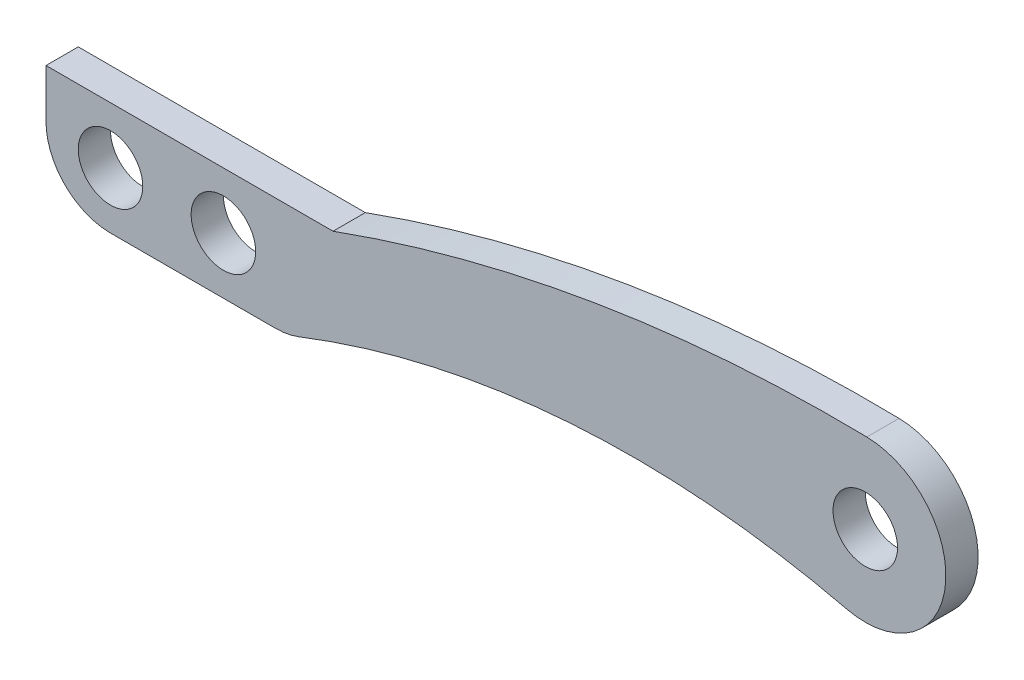
ISO-10303-21;
HEADER;
FILE_DESCRIPTION(('STEP AP214'),'2;1');
FILE_NAME('part.step','',(''),(''),'','','');
FILE_SCHEMA(('AUTOMOTIVE_DESIGN { 1 0 10303 214 1 1 1 1 }'));
ENDSEC;
DATA;
#1=APPLICATION_CONTEXT('core data for automotive mechanical design processes');
#2=APPLICATION_PROTOCOL_DEFINITION('international standard','automotive_design',2000,#1);
#3=PRODUCT_CONTEXT('',#1,'mechanical');
#4=PRODUCT('Part','Part','',(#3));
#5=PRODUCT_RELATED_PRODUCT_CATEGORY('part','',(#4));
#6=PRODUCT_DEFINITION_FORMATION('','',#4);
#7=PRODUCT_DEFINITION_CONTEXT('part definition',#1,'design');
#8=PRODUCT_DEFINITION('design','',#6,#7);
#9=PRODUCT_DEFINITION_SHAPE('','',#8);
#10=(LENGTH_UNIT() NAMED_UNIT(*) SI_UNIT(.MILLI.,.METRE.));
#11=(NAMED_UNIT(*) PLANE_ANGLE_UNIT() SI_UNIT($,.RADIAN.));
#12=(NAMED_UNIT(*) SI_UNIT($,.STERADIAN.) SOLID_ANGLE_UNIT());
#13=UNCERTAINTY_MEASURE_WITH_UNIT(LENGTH_MEASURE(1.E-05),#10,'distance_accuracy_value','');
#14=(GEOMETRIC_REPRESENTATION_CONTEXT(3) GLOBAL_UNCERTAINTY_ASSIGNED_CONTEXT((#13)) GLOBAL_UNIT_ASSIGNED_CONTEXT((#10,
#11,#12)) REPRESENTATION_CONTEXT('',''));
#15=CARTESIAN_POINT('',(0.,0.,0.));
#16=DIRECTION('',(0.,0.,1.));
#17=DIRECTION('',(1.,0.,0.));
#18=AXIS2_PLACEMENT_3D('',#15,#16,#17);
#19=CARTESIAN_POINT('',(-1.68559966933592,-82.6218206268052,2.));
#20=DIRECTION('',(0.,0.,-1.));
#21=DIRECTION('',(-1.,0.,0.));
#22=AXIS2_PLACEMENT_3D('',#19,#20,#21);
#23=PLANE('',#22);
#24=DIRECTION('',(1.,0.,0.));
#25=VECTOR('',#24,1.);
#26=CARTESIAN_POINT('',(-50.8005052761205,-3.5,2.));
#27=LINE('',#26,#25);
#28=CARTESIAN_POINT('',(-46.8005052761205,-3.5,2.));
#29=VERTEX_POINT('',#28);
#30=CARTESIAN_POINT('',(-36.5672802641637,-3.5,2.));
#31=VERTEX_POINT('',#30);
#32=EDGE_CURVE('E110',#29,#31,#27,.T.);
#33=ORIENTED_EDGE('',*,*,#32,.T.);
#34=CARTESIAN_POINT('',(-36.5672802641637,0.5,2.));
#35=DIRECTION('',(0.,0.,-1.));
#36=DIRECTION('',(-1.,0.,0.));
#37=AXIS2_PLACEMENT_3D('',#34,#35,#36);
#38=CIRCLE('',#37,4.);
#39=CARTESIAN_POINT('',(-35.1118539825117,-3.22581995521478,2.));
#40=VERTEX_POINT('',#39);
#41=EDGE_CURVE('E42',#31,#40,#38,.F.);
#42=ORIENTED_EDGE('',*,*,#41,.T.);
#43=CARTESIAN_POINT('',(-14.357560801915,-56.3557933956249,2.));
#44=DIRECTION('',(0.,0.,-1.));
#45=DIRECTION('',(1.,0.,0.));
#46=AXIS2_PLACEMENT_3D('',#43,#44,#45);
#47=CIRCLE('',#46,57.0397647541156);
#48=CARTESIAN_POINT('',(-1.15805223479963,-0.864282902654057,2.));
#49=VERTEX_POINT('',#48);
#50=EDGE_CURVE('E100',#40,#49,#47,.T.);
#51=ORIENTED_EDGE('',*,*,#50,.T.);
#52=CARTESIAN_POINT('',(-0.00100779185573802,4.,2.));
#53=DIRECTION('',(0.,0.,1.));
#54=DIRECTION('',(1.,0.,0.));
#55=AXIS2_PLACEMENT_3D('',#52,#53,#54);
#56=CIRCLE('',#55,5.);
#57=CARTESIAN_POINT('',(0.0962121343463812,8.99905473924314,2.));
#58=VERTEX_POINT('',#57);
#59=EDGE_CURVE('E104',#49,#58,#56,.T.);
#60=ORIENTED_EDGE('',*,*,#59,.T.);
#61=CARTESIAN_POINT('',(-1.68559966933592,-82.6218206268052,2.));
#62=DIRECTION('',(0.,0.,1.));
#63=DIRECTION('',(-1.,0.,0.));
#64=AXIS2_PLACEMENT_3D('',#61,#62,#63);
#65=CIRCLE('',#64,91.6381997648617);
#66=CARTESIAN_POINT('',(-33.,3.49999999999999,2.));
#67=VERTEX_POINT('',#66);
#68=EDGE_CURVE('E125',#58,#67,#65,.T.);
#69=ORIENTED_EDGE('',*,*,#68,.T.);
#70=DIRECTION('',(-1.,0.,0.));
#71=VECTOR('',#70,1.);
#72=CARTESIAN_POINT('',(-36.,3.5,2.));
#73=LINE('',#72,#71);
#74=CARTESIAN_POINT('',(-50.8005052761205,3.5,2.));
#75=VERTEX_POINT('',#74);
#76=EDGE_CURVE('E127',#67,#75,#73,.T.);
#77=ORIENTED_EDGE('',*,*,#76,.T.);
#78=DIRECTION('',(0.,-1.,0.));
#79=VECTOR('',#78,1.);
#80=CARTESIAN_POINT('',(-50.8005052761205,-3.5,2.));
#81=LINE('',#80,#79);
#82=CARTESIAN_POINT('',(-50.8005052761205,0.5,2.));
#83=VERTEX_POINT('',#82);
#84=EDGE_CURVE('E146',#75,#83,#81,.T.);
#85=ORIENTED_EDGE('',*,*,#84,.T.);
#86=CARTESIAN_POINT('',(-46.8005052761205,0.5,2.));
#87=DIRECTION('',(0.,0.,-1.));
#88=DIRECTION('',(-1.,0.,0.));
#89=AXIS2_PLACEMENT_3D('',#86,#87,#88);
#90=CIRCLE('',#89,4.);
#91=EDGE_CURVE('E162',#83,#29,#90,.F.);
#92=ORIENTED_EDGE('',*,*,#91,.T.);
#93=EDGE_LOOP('',(#33,#42,#51,#60,#69,#77,#85,#92));
#94=FACE_BOUND('',#93,.T.);
#95=CARTESIAN_POINT('',(-0.00100779185573802,4.,2.));
#96=DIRECTION('',(0.,0.,1.));
#97=DIRECTION('',(1.,0.,0.));
#98=AXIS2_PLACEMENT_3D('',#95,#96,#97);
#99=CIRCLE('',#98,2.);
#100=CARTESIAN_POINT('',(1.99899220814426,4.,2.));
#101=VERTEX_POINT('',#100);
#102=EDGE_CURVE('E136',#101,#101,#99,.T.);
#103=ORIENTED_EDGE('',*,*,#102,.F.);
#104=EDGE_LOOP('',(#103));
#105=FACE_BOUND('',#104,.T.);
#106=CARTESIAN_POINT('',(-46.8005052761205,0.,2.));
#107=DIRECTION('',(0.,0.,1.));
#108=DIRECTION('',(1.,0.,0.));
#109=AXIS2_PLACEMENT_3D('',#106,#107,#108);
#110=CIRCLE('',#109,2.);
#111=CARTESIAN_POINT('',(-44.8005052761205,0.,2.));
#112=VERTEX_POINT('',#111);
#113=EDGE_CURVE('E225',#112,#112,#110,.T.);
#114=ORIENTED_EDGE('',*,*,#113,.F.);
#115=EDGE_LOOP('',(#114));
#116=FACE_BOUND('',#115,.T.);
#117=CARTESIAN_POINT('',(-39.8005052761205,0.,2.));
#118=DIRECTION('',(0.,0.,1.));
#119=DIRECTION('',(1.,0.,0.));
#120=AXIS2_PLACEMENT_3D('',#117,#118,#119);
#121=CIRCLE('',#120,2.);
#122=CARTESIAN_POINT('',(-37.8005052761205,0.,2.));
#123=VERTEX_POINT('',#122);
#124=EDGE_CURVE('E216',#123,#123,#121,.T.);
#125=ORIENTED_EDGE('',*,*,#124,.F.);
#126=EDGE_LOOP('',(#125));
#127=FACE_BOUND('',#126,.T.);
#128=ADVANCED_FACE('F34',(#94,#105,#116,#127),#23,.F.);
#129=CARTESIAN_POINT('',(-1.68559966933592,-82.6218206268052,0.));
#130=DIRECTION('',(0.,0.,-1.));
#131=DIRECTION('',(-1.,0.,0.));
#132=AXIS2_PLACEMENT_3D('',#129,#130,#131);
#133=PLANE('',#132);
#134=CARTESIAN_POINT('',(-46.8005052761205,0.,0.));
#135=DIRECTION('',(0.,0.,1.));
#136=DIRECTION('',(1.,0.,0.));
#137=AXIS2_PLACEMENT_3D('',#134,#135,#136);
#138=CIRCLE('',#137,2.);
#139=CARTESIAN_POINT('',(-44.8005052761205,0.,0.));
#140=VERTEX_POINT('',#139);
#141=EDGE_CURVE('E222',#140,#140,#138,.T.);
#142=ORIENTED_EDGE('',*,*,#141,.T.);
#143=EDGE_LOOP('',(#142));
#144=FACE_BOUND('',#143,.T.);
#145=CARTESIAN_POINT('',(-14.357560801915,-56.3557933956249,0.));
#146=DIRECTION('',(0.,0.,-1.));
#147=DIRECTION('',(1.,0.,0.));
#148=AXIS2_PLACEMENT_3D('',#145,#146,#147);
#149=CIRCLE('',#148,57.0397647541156);
#150=CARTESIAN_POINT('',(-35.1118539825117,-3.22581995521478,0.));
#151=VERTEX_POINT('',#150);
#152=CARTESIAN_POINT('',(-1.15805223479963,-0.864282902654057,0.));
#153=VERTEX_POINT('',#152);
#154=EDGE_CURVE('E116',#151,#153,#149,.T.);
#155=ORIENTED_EDGE('',*,*,#154,.F.);
#156=CARTESIAN_POINT('',(-36.5672802641637,0.5,0.));
#157=DIRECTION('',(0.,0.,-1.));
#158=DIRECTION('',(-1.,0.,0.));
#159=AXIS2_PLACEMENT_3D('',#156,#157,#158);
#160=CIRCLE('',#159,4.);
#161=CARTESIAN_POINT('',(-36.5672802641637,-3.5,0.));
#162=VERTEX_POINT('',#161);
#163=EDGE_CURVE('E156',#151,#162,#160,.T.);
#164=ORIENTED_EDGE('',*,*,#163,.T.);
#165=DIRECTION('',(1.,0.,0.));
#166=VECTOR('',#165,1.);
#167=CARTESIAN_POINT('',(-50.8005052761205,-3.5,0.));
#168=LINE('',#167,#166);
#169=CARTESIAN_POINT('',(-46.8005052761205,-3.5,0.));
#170=VERTEX_POINT('',#169);
#171=EDGE_CURVE('E135',#170,#162,#168,.T.);
#172=ORIENTED_EDGE('',*,*,#171,.F.);
#173=CARTESIAN_POINT('',(-46.8005052761205,0.5,0.));
#174=DIRECTION('',(0.,0.,-1.));
#175=DIRECTION('',(-1.,0.,0.));
#176=AXIS2_PLACEMENT_3D('',#173,#174,#175);
#177=CIRCLE('',#176,4.);
#178=CARTESIAN_POINT('',(-50.8005052761205,0.5,0.));
#179=VERTEX_POINT('',#178);
#180=EDGE_CURVE('E154',#170,#179,#177,.T.);
#181=ORIENTED_EDGE('',*,*,#180,.T.);
#182=DIRECTION('',(0.,-1.,0.));
#183=VECTOR('',#182,1.);
#184=CARTESIAN_POINT('',(-50.8005052761205,-3.5,0.));
#185=LINE('',#184,#183);
#186=CARTESIAN_POINT('',(-50.8005052761205,3.5,0.));
#187=VERTEX_POINT('',#186);
#188=EDGE_CURVE('E133',#187,#179,#185,.T.);
#189=ORIENTED_EDGE('',*,*,#188,.F.);
#190=DIRECTION('',(-1.,0.,0.));
#191=VECTOR('',#190,1.);
#192=CARTESIAN_POINT('',(-50.8005052761205,3.5,0.));
#193=LINE('',#192,#191);
#194=CARTESIAN_POINT('',(-33.,3.49999999999999,0.));
#195=VERTEX_POINT('',#194);
#196=EDGE_CURVE('E144',#195,#187,#193,.T.);
#197=ORIENTED_EDGE('',*,*,#196,.F.);
#198=CARTESIAN_POINT('',(-1.68559966933592,-82.6218206268052,0.));
#199=DIRECTION('',(0.,0.,1.));
#200=DIRECTION('',(-1.,0.,0.));
#201=AXIS2_PLACEMENT_3D('',#198,#199,#200);
#202=CIRCLE('',#201,91.6381997648617);
#203=CARTESIAN_POINT('',(0.0962121343463812,8.99905473924314,0.));
#204=VERTEX_POINT('',#203);
#205=EDGE_CURVE('E141',#204,#195,#202,.T.);
#206=ORIENTED_EDGE('',*,*,#205,.F.);
#207=CARTESIAN_POINT('',(-0.00100779185573802,4.,0.));
#208=DIRECTION('',(0.,0.,1.));
#209=DIRECTION('',(1.,0.,0.));
#210=AXIS2_PLACEMENT_3D('',#207,#208,#209);
#211=CIRCLE('',#210,5.);
#212=EDGE_CURVE('E139',#153,#204,#211,.T.);
#213=ORIENTED_EDGE('',*,*,#212,.F.);
#214=EDGE_LOOP('',(#155,#164,#172,#181,#189,#197,#206,#213));
#215=FACE_BOUND('',#214,.T.);
#216=CARTESIAN_POINT('',(-0.00100779185573802,4.,0.));
#217=DIRECTION('',(0.,0.,1.));
#218=DIRECTION('',(1.,0.,0.));
#219=AXIS2_PLACEMENT_3D('',#216,#217,#218);
#220=CIRCLE('',#219,2.);
#221=CARTESIAN_POINT('',(1.99899220814426,4.,0.));
#222=VERTEX_POINT('',#221);
#223=EDGE_CURVE('E228',#222,#222,#220,.T.);
#224=ORIENTED_EDGE('',*,*,#223,.T.);
#225=EDGE_LOOP('',(#224));
#226=FACE_BOUND('',#225,.T.);
#227=CARTESIAN_POINT('',(-39.8005052761205,0.,0.));
#228=DIRECTION('',(0.,0.,1.));
#229=DIRECTION('',(1.,0.,0.));
#230=AXIS2_PLACEMENT_3D('',#227,#228,#229);
#231=CIRCLE('',#230,2.);
#232=CARTESIAN_POINT('',(-37.8005052761205,0.,0.));
#233=VERTEX_POINT('',#232);
#234=EDGE_CURVE('E219',#233,#233,#231,.T.);
#235=ORIENTED_EDGE('',*,*,#234,.T.);
#236=EDGE_LOOP('',(#235));
#237=FACE_BOUND('',#236,.T.);
#238=ADVANCED_FACE('F170',(#144,#215,#226,#237),#133,.T.);
#239=CARTESIAN_POINT('',(-50.8005052761205,-3.5,2.));
#240=DIRECTION('',(1.,0.,0.));
#241=DIRECTION('',(0.,0.,-1.));
#242=AXIS2_PLACEMENT_3D('',#239,#240,#241);
#243=PLANE('',#242);
#244=ORIENTED_EDGE('',*,*,#188,.T.);
#245=DIRECTION('',(0.,0.,-1.));
#246=VECTOR('',#245,1.);
#247=CARTESIAN_POINT('',(-50.8005052761205,0.5,2.));
#248=LINE('',#247,#246);
#249=EDGE_CURVE('E11',#179,#83,#248,.F.);
#250=ORIENTED_EDGE('',*,*,#249,.T.);
#251=ORIENTED_EDGE('',*,*,#84,.F.);
#252=DIRECTION('',(0.,0.,-1.));
#253=VECTOR('',#252,1.);
#254=CARTESIAN_POINT('',(-50.8005052761205,3.5,2.));
#255=LINE('',#254,#253);
#256=EDGE_CURVE('E132',#75,#187,#255,.T.);
#257=ORIENTED_EDGE('',*,*,#256,.T.);
#258=EDGE_LOOP('',(#244,#250,#251,#257));
#259=FACE_BOUND('',#258,.T.);
#260=ADVANCED_FACE('F172',(#259),#243,.F.);
#261=CARTESIAN_POINT('',(-50.8005052761205,-3.5,2.));
#262=DIRECTION('',(0.,1.,0.));
#263=DIRECTION('',(0.,0.,1.));
#264=AXIS2_PLACEMENT_3D('',#261,#262,#263);
#265=PLANE('',#264);
#266=ORIENTED_EDGE('',*,*,#171,.T.);
#267=DIRECTION('',(0.,0.,-1.));
#268=VECTOR('',#267,1.);
#269=CARTESIAN_POINT('',(-36.5672802641637,-3.5,2.));
#270=LINE('',#269,#268);
#271=EDGE_CURVE('E55',#162,#31,#270,.F.);
#272=ORIENTED_EDGE('',*,*,#271,.T.);
#273=ORIENTED_EDGE('',*,*,#32,.F.);
#274=DIRECTION('',(0.,0.,-1.));
#275=VECTOR('',#274,1.);
#276=CARTESIAN_POINT('',(-46.8005052761205,-3.5,2.));
#277=LINE('',#276,#275);
#278=EDGE_CURVE('E158',#29,#170,#277,.T.);
#279=ORIENTED_EDGE('',*,*,#278,.T.);
#280=EDGE_LOOP('',(#266,#272,#273,#279));
#281=FACE_BOUND('',#280,.T.);
#282=ADVANCED_FACE('F166',(#281),#265,.F.);
#283=CARTESIAN_POINT('',(-14.357560801915,-56.3557933956249,2.));
#284=DIRECTION('',(0.,0.,-1.));
#285=DIRECTION('',(-1.,0.,0.));
#286=AXIS2_PLACEMENT_3D('',#283,#284,#285);
#287=CYLINDRICAL_SURFACE('',#286,57.0397647541156);
#288=ORIENTED_EDGE('',*,*,#50,.F.);
#289=DIRECTION('',(0.,0.,-1.));
#290=VECTOR('',#289,1.);
#291=CARTESIAN_POINT('',(-35.1118539825117,-3.22581995521478,2.));
#292=LINE('',#291,#290);
#293=EDGE_CURVE('E119',#40,#151,#292,.T.);
#294=ORIENTED_EDGE('',*,*,#293,.T.);
#295=ORIENTED_EDGE('',*,*,#154,.T.);
#296=DIRECTION('',(0.,0.,-1.));
#297=VECTOR('',#296,1.);
#298=CARTESIAN_POINT('',(-1.15805223479963,-0.864282902654057,2.));
#299=LINE('',#298,#297);
#300=EDGE_CURVE('E113',#49,#153,#299,.T.);
#301=ORIENTED_EDGE('',*,*,#300,.F.);
#302=EDGE_LOOP('',(#288,#294,#295,#301));
#303=FACE_BOUND('',#302,.T.);
#304=ADVANCED_FACE('F114',(#303),#287,.F.);
#305=CARTESIAN_POINT('',(-0.00100779185573802,4.,2.));
#306=DIRECTION('',(0.,0.,-1.));
#307=DIRECTION('',(-1.,0.,0.));
#308=AXIS2_PLACEMENT_3D('',#305,#306,#307);
#309=CYLINDRICAL_SURFACE('',#308,5.);
#310=ORIENTED_EDGE('',*,*,#212,.T.);
#311=DIRECTION('',(0.,0.,-1.));
#312=VECTOR('',#311,1.);
#313=CARTESIAN_POINT('',(0.0962121343463812,8.99905473924314,2.));
#314=LINE('',#313,#312);
#315=EDGE_CURVE('E120',#58,#204,#314,.T.);
#316=ORIENTED_EDGE('',*,*,#315,.F.);
#317=ORIENTED_EDGE('',*,*,#59,.F.);
#318=ORIENTED_EDGE('',*,*,#300,.T.);
#319=EDGE_LOOP('',(#310,#316,#317,#318));
#320=FACE_BOUND('',#319,.T.);
#321=ADVANCED_FACE('F122',(#320),#309,.T.);
#322=CARTESIAN_POINT('',(-1.68559966933592,-82.6218206268052,2.));
#323=DIRECTION('',(0.,0.,-1.));
#324=DIRECTION('',(-1.,0.,0.));
#325=AXIS2_PLACEMENT_3D('',#322,#323,#324);
#326=CYLINDRICAL_SURFACE('',#325,91.6381997648617);
#327=ORIENTED_EDGE('',*,*,#205,.T.);
#328=DIRECTION('',(0.,0.,-1.));
#329=VECTOR('',#328,1.);
#330=CARTESIAN_POINT('',(-33.,3.49999999999999,2.));
#331=LINE('',#330,#329);
#332=EDGE_CURVE('E149',#67,#195,#331,.T.);
#333=ORIENTED_EDGE('',*,*,#332,.F.);
#334=ORIENTED_EDGE('',*,*,#68,.F.);
#335=ORIENTED_EDGE('',*,*,#315,.T.);
#336=EDGE_LOOP('',(#327,#333,#334,#335));
#337=FACE_BOUND('',#336,.T.);
#338=ADVANCED_FACE('F180',(#337),#326,.T.);
#339=CARTESIAN_POINT('',(-50.8005052761205,3.5,2.));
#340=DIRECTION('',(0.,-1.,0.));
#341=DIRECTION('',(0.,0.,-1.));
#342=AXIS2_PLACEMENT_3D('',#339,#340,#341);
#343=PLANE('',#342);
#344=ORIENTED_EDGE('',*,*,#196,.T.);
#345=ORIENTED_EDGE('',*,*,#256,.F.);
#346=ORIENTED_EDGE('',*,*,#76,.F.);
#347=ORIENTED_EDGE('',*,*,#332,.T.);
#348=EDGE_LOOP('',(#344,#345,#346,#347));
#349=FACE_BOUND('',#348,.T.);
#350=ADVANCED_FACE('F176',(#349),#343,.F.);
#351=CARTESIAN_POINT('',(-0.00100779185573802,4.,2.));
#352=DIRECTION('',(0.,0.,-1.));
#353=DIRECTION('',(-1.,0.,0.));
#354=AXIS2_PLACEMENT_3D('',#351,#352,#353);
#355=CYLINDRICAL_SURFACE('',#354,2.);
#356=ORIENTED_EDGE('',*,*,#102,.T.);
#357=EDGE_LOOP('',(#356));
#358=FACE_BOUND('',#357,.T.);
#359=ORIENTED_EDGE('',*,*,#223,.F.);
#360=EDGE_LOOP('',(#359));
#361=FACE_BOUND('',#360,.T.);
#362=ADVANCED_FACE('F187',(#358,#361),#355,.F.);
#363=CARTESIAN_POINT('',(-46.8005052761205,0.,2.));
#364=DIRECTION('',(0.,0.,-1.));
#365=DIRECTION('',(-1.,0.,0.));
#366=AXIS2_PLACEMENT_3D('',#363,#364,#365);
#367=CYLINDRICAL_SURFACE('',#366,2.);
#368=ORIENTED_EDGE('',*,*,#113,.T.);
#369=EDGE_LOOP('',(#368));
#370=FACE_BOUND('',#369,.T.);
#371=ORIENTED_EDGE('',*,*,#141,.F.);
#372=EDGE_LOOP('',(#371));
#373=FACE_BOUND('',#372,.T.);
#374=ADVANCED_FACE('F200',(#370,#373),#367,.F.);
#375=CARTESIAN_POINT('',(-39.8005052761205,0.,2.));
#376=DIRECTION('',(0.,0.,-1.));
#377=DIRECTION('',(-1.,0.,0.));
#378=AXIS2_PLACEMENT_3D('',#375,#376,#377);
#379=CYLINDRICAL_SURFACE('',#378,2.);
#380=ORIENTED_EDGE('',*,*,#124,.T.);
#381=EDGE_LOOP('',(#380));
#382=FACE_BOUND('',#381,.T.);
#383=ORIENTED_EDGE('',*,*,#234,.F.);
#384=EDGE_LOOP('',(#383));
#385=FACE_BOUND('',#384,.T.);
#386=ADVANCED_FACE('F204',(#382,#385),#379,.F.);
#387=CARTESIAN_POINT('',(-36.5672802641637,0.5,2.));
#388=DIRECTION('',(0.,0.,-1.));
#389=DIRECTION('',(-1.,0.,0.));
#390=AXIS2_PLACEMENT_3D('',#387,#388,#389);
#391=CYLINDRICAL_SURFACE('',#390,4.);
#392=ORIENTED_EDGE('',*,*,#41,.F.);
#393=ORIENTED_EDGE('',*,*,#271,.F.);
#394=ORIENTED_EDGE('',*,*,#163,.F.);
#395=ORIENTED_EDGE('',*,*,#293,.F.);
#396=EDGE_LOOP('',(#392,#393,#394,#395));
#397=FACE_BOUND('',#396,.T.);
#398=ADVANCED_FACE('F207',(#397),#391,.T.);
#399=CARTESIAN_POINT('',(-46.8005052761205,0.5,2.));
#400=DIRECTION('',(0.,0.,-1.));
#401=DIRECTION('',(-1.,0.,0.));
#402=AXIS2_PLACEMENT_3D('',#399,#400,#401);
#403=CYLINDRICAL_SURFACE('',#402,4.);
#404=ORIENTED_EDGE('',*,*,#91,.F.);
#405=ORIENTED_EDGE('',*,*,#249,.F.);
#406=ORIENTED_EDGE('',*,*,#180,.F.);
#407=ORIENTED_EDGE('',*,*,#278,.F.);
#408=EDGE_LOOP('',(#404,#405,#406,#407));
#409=FACE_BOUND('',#408,.T.);
#410=ADVANCED_FACE('F36',(#409),#403,.T.);
#411=CLOSED_SHELL('',(#128,#238,#260,#282,#304,#321,#338,#350,#362,#374,#386,#398,#410));
#412=MANIFOLD_SOLID_BREP('B2',#411);
#413=ADVANCED_BREP_SHAPE_REPRESENTATION('',(#18,#412),#14);
#414=SHAPE_DEFINITION_REPRESENTATION(#9,#413);
ENDSEC;
END-ISO-10303-21;
